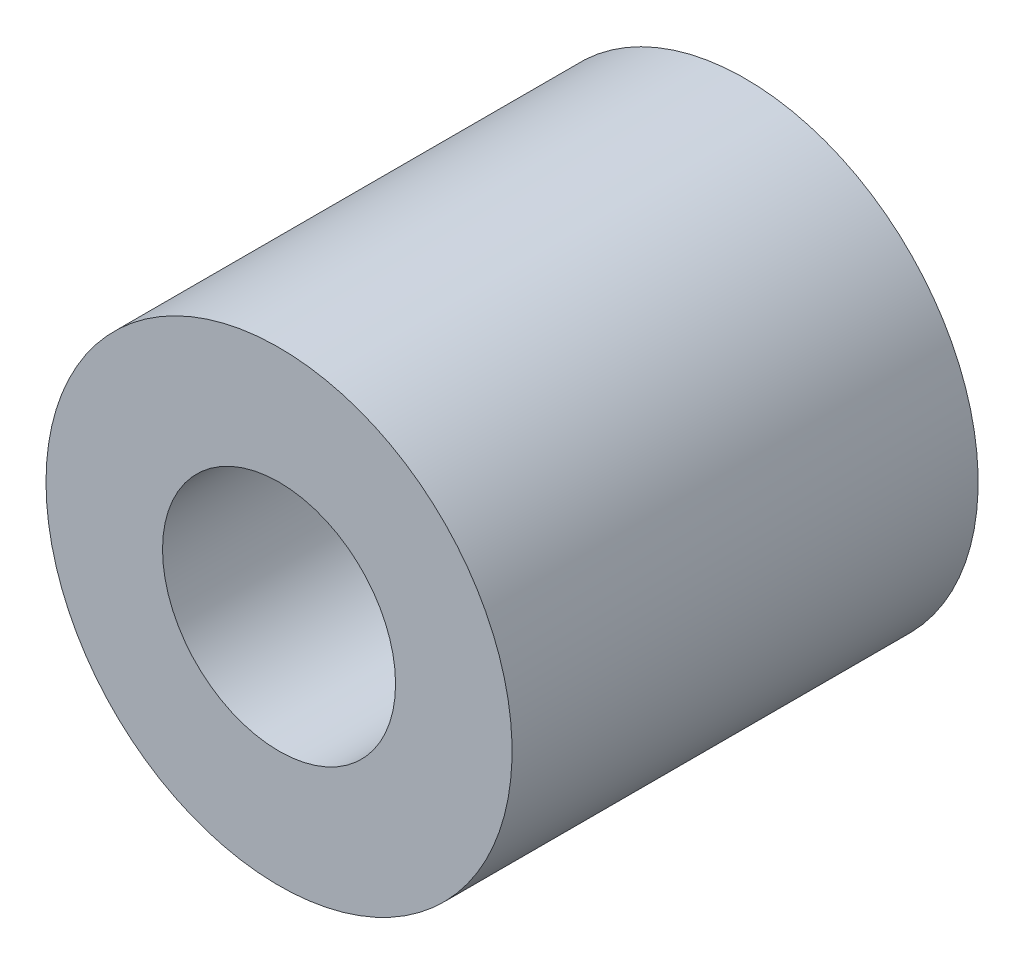
ISO-10303-21;
HEADER;
FILE_DESCRIPTION(('STEP AP214'),'2;1');
FILE_NAME('part.step','',(''),(''),'','','');
FILE_SCHEMA(('AUTOMOTIVE_DESIGN { 1 0 10303 214 1 1 1 1 }'));
ENDSEC;
DATA;
#1=APPLICATION_CONTEXT('core data for automotive mechanical design processes');
#2=APPLICATION_PROTOCOL_DEFINITION('international standard','automotive_design',2000,#1);
#3=PRODUCT_CONTEXT('',#1,'mechanical');
#4=PRODUCT('Part','Part','',(#3));
#5=PRODUCT_RELATED_PRODUCT_CATEGORY('part','',(#4));
#6=PRODUCT_DEFINITION_FORMATION('','',#4);
#7=PRODUCT_DEFINITION_CONTEXT('part definition',#1,'design');
#8=PRODUCT_DEFINITION('design','',#6,#7);
#9=PRODUCT_DEFINITION_SHAPE('','',#8);
#10=(LENGTH_UNIT() NAMED_UNIT(*) SI_UNIT(.MILLI.,.METRE.));
#11=(NAMED_UNIT(*) PLANE_ANGLE_UNIT() SI_UNIT($,.RADIAN.));
#12=(NAMED_UNIT(*) SI_UNIT($,.STERADIAN.) SOLID_ANGLE_UNIT());
#13=UNCERTAINTY_MEASURE_WITH_UNIT(LENGTH_MEASURE(1.E-05),#10,'distance_accuracy_value','');
#14=(GEOMETRIC_REPRESENTATION_CONTEXT(3) GLOBAL_UNCERTAINTY_ASSIGNED_CONTEXT((#13)) GLOBAL_UNIT_ASSIGNED_CONTEXT((#10,
#11,#12)) REPRESENTATION_CONTEXT('',''));
#15=CARTESIAN_POINT('',(0.,0.,0.));
#16=DIRECTION('',(0.,0.,1.));
#17=DIRECTION('',(1.,0.,0.));
#18=AXIS2_PLACEMENT_3D('',#15,#16,#17);
#19=CARTESIAN_POINT('',(0.,0.,0.));
#20=DIRECTION('',(0.,0.,-1.));
#21=DIRECTION('',(-1.,0.,0.));
#22=AXIS2_PLACEMENT_3D('',#19,#20,#21);
#23=CYLINDRICAL_SURFACE('',#22,3.);
#24=CARTESIAN_POINT('',(0.,0.,12.));
#25=DIRECTION('',(0.,0.,-1.));
#26=DIRECTION('',(-1.,0.,0.));
#27=AXIS2_PLACEMENT_3D('',#24,#25,#26);
#28=CIRCLE('',#27,3.);
#29=CARTESIAN_POINT('',(-3.,0.,12.));
#30=VERTEX_POINT('',#29);
#31=EDGE_CURVE('E10',#30,#30,#28,.T.);
#32=ORIENTED_EDGE('',*,*,#31,.F.);
#33=EDGE_LOOP('',(#32));
#34=FACE_BOUND('',#33,.T.);
#35=CARTESIAN_POINT('',(0.,0.,0.));
#36=DIRECTION('',(0.,0.,-1.));
#37=DIRECTION('',(-1.,0.,0.));
#38=AXIS2_PLACEMENT_3D('',#35,#36,#37);
#39=CIRCLE('',#38,3.);
#40=CARTESIAN_POINT('',(-3.,0.,0.));
#41=VERTEX_POINT('',#40);
#42=EDGE_CURVE('E54',#41,#41,#39,.T.);
#43=ORIENTED_EDGE('',*,*,#42,.T.);
#44=EDGE_LOOP('',(#43));
#45=FACE_BOUND('',#44,.T.);
#46=ADVANCED_FACE('F41',(#34,#45),#23,.F.);
#47=CARTESIAN_POINT('',(3.,0.,12.));
#48=DIRECTION('',(0.,0.,-1.));
#49=DIRECTION('',(-1.,0.,0.));
#50=AXIS2_PLACEMENT_3D('',#47,#48,#49);
#51=PLANE('',#50);
#52=CARTESIAN_POINT('',(0.,0.,12.));
#53=DIRECTION('',(0.,0.,-1.));
#54=DIRECTION('',(-1.,0.,0.));
#55=AXIS2_PLACEMENT_3D('',#52,#53,#54);
#56=CIRCLE('',#55,6.);
#57=CARTESIAN_POINT('',(-6.,0.,12.));
#58=VERTEX_POINT('',#57);
#59=EDGE_CURVE('E50',#58,#58,#56,.T.);
#60=ORIENTED_EDGE('',*,*,#59,.F.);
#61=EDGE_LOOP('',(#60));
#62=FACE_BOUND('',#61,.T.);
#63=ORIENTED_EDGE('',*,*,#31,.T.);
#64=EDGE_LOOP('',(#63));
#65=FACE_BOUND('',#64,.T.);
#66=ADVANCED_FACE('F68',(#62,#65),#51,.F.);
#67=CARTESIAN_POINT('',(0.,0.,0.));
#68=DIRECTION('',(0.,0.,-1.));
#69=DIRECTION('',(-1.,0.,0.));
#70=AXIS2_PLACEMENT_3D('',#67,#68,#69);
#71=CYLINDRICAL_SURFACE('',#70,6.);
#72=CARTESIAN_POINT('',(0.,0.,0.));
#73=DIRECTION('',(0.,0.,-1.));
#74=DIRECTION('',(-1.,0.,0.));
#75=AXIS2_PLACEMENT_3D('',#72,#73,#74);
#76=CIRCLE('',#75,6.);
#77=CARTESIAN_POINT('',(-6.,0.,0.));
#78=VERTEX_POINT('',#77);
#79=EDGE_CURVE('E51',#78,#78,#76,.T.);
#80=ORIENTED_EDGE('',*,*,#79,.F.);
#81=EDGE_LOOP('',(#80));
#82=FACE_BOUND('',#81,.T.);
#83=ORIENTED_EDGE('',*,*,#59,.T.);
#84=EDGE_LOOP('',(#83));
#85=FACE_BOUND('',#84,.T.);
#86=ADVANCED_FACE('F63',(#82,#85),#71,.T.);
#87=CARTESIAN_POINT('',(3.,0.,0.));
#88=DIRECTION('',(0.,0.,1.));
#89=DIRECTION('',(1.,0.,0.));
#90=AXIS2_PLACEMENT_3D('',#87,#88,#89);
#91=PLANE('',#90);
#92=ORIENTED_EDGE('',*,*,#42,.F.);
#93=EDGE_LOOP('',(#92));
#94=FACE_BOUND('',#93,.T.);
#95=ORIENTED_EDGE('',*,*,#79,.T.);
#96=EDGE_LOOP('',(#95));
#97=FACE_BOUND('',#96,.T.);
#98=ADVANCED_FACE('F65',(#94,#97),#91,.F.);
#99=CLOSED_SHELL('',(#46,#66,#86,#98));
#100=MANIFOLD_SOLID_BREP('B2',#99);
#101=ADVANCED_BREP_SHAPE_REPRESENTATION('',(#18,#100),#14);
#102=SHAPE_DEFINITION_REPRESENTATION(#9,#101);
ENDSEC;
END-ISO-10303-21;
